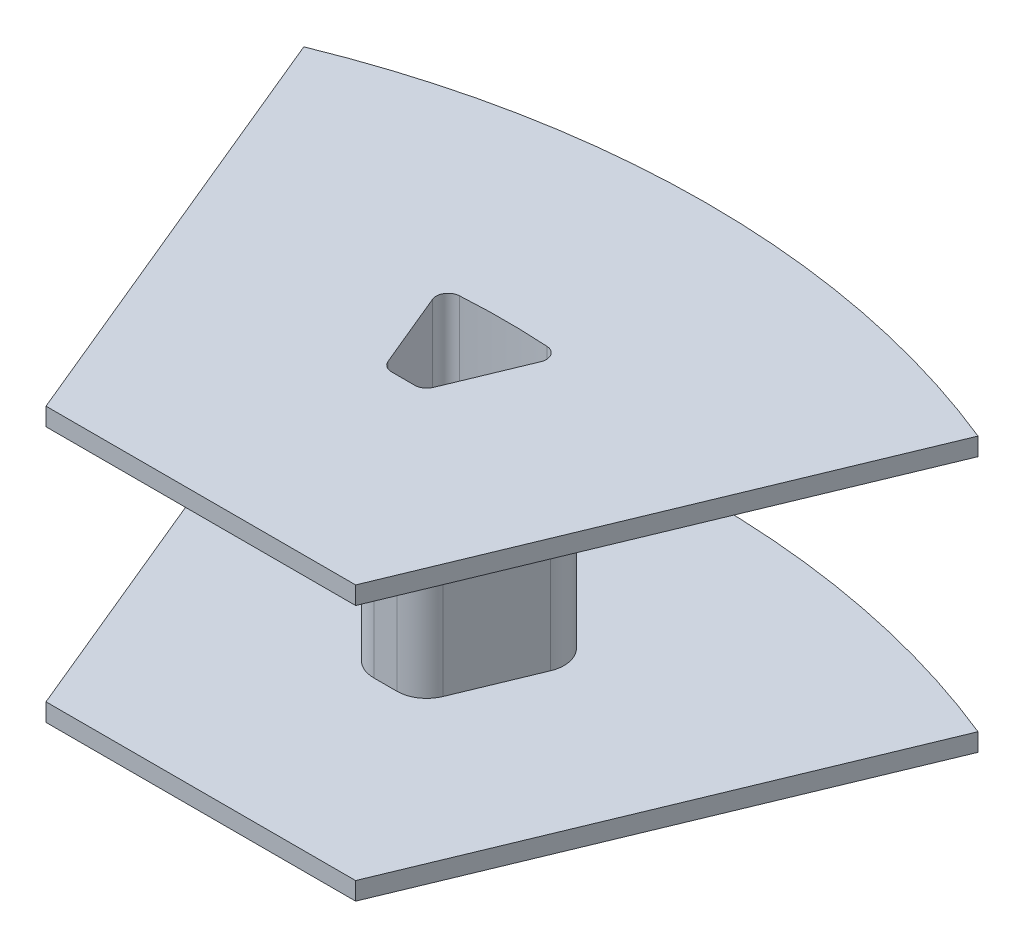
ISO-10303-21;
HEADER;
FILE_DESCRIPTION(('STEP AP214'),'2;1');
FILE_NAME('part.step','',(''),(''),'','','');
FILE_SCHEMA(('AUTOMOTIVE_DESIGN { 1 0 10303 214 1 1 1 1 }'));
ENDSEC;
DATA;
#1=APPLICATION_CONTEXT('core data for automotive mechanical design processes');
#2=APPLICATION_PROTOCOL_DEFINITION('international standard','automotive_design',2000,#1);
#3=PRODUCT_CONTEXT('',#1,'mechanical');
#4=PRODUCT('Part','Part','',(#3));
#5=PRODUCT_RELATED_PRODUCT_CATEGORY('part','',(#4));
#6=PRODUCT_DEFINITION_FORMATION('','',#4);
#7=PRODUCT_DEFINITION_CONTEXT('part definition',#1,'design');
#8=PRODUCT_DEFINITION('design','',#6,#7);
#9=PRODUCT_DEFINITION_SHAPE('','',#8);
#10=(LENGTH_UNIT() NAMED_UNIT(*) SI_UNIT(.MILLI.,.METRE.));
#11=(NAMED_UNIT(*) PLANE_ANGLE_UNIT() SI_UNIT($,.RADIAN.));
#12=(NAMED_UNIT(*) SI_UNIT($,.STERADIAN.) SOLID_ANGLE_UNIT());
#13=UNCERTAINTY_MEASURE_WITH_UNIT(LENGTH_MEASURE(1.E-05),#10,'distance_accuracy_value','');
#14=(GEOMETRIC_REPRESENTATION_CONTEXT(3) GLOBAL_UNCERTAINTY_ASSIGNED_CONTEXT((#13)) GLOBAL_UNIT_ASSIGNED_CONTEXT((#10,
#11,#12)) REPRESENTATION_CONTEXT('',''));
#15=CARTESIAN_POINT('',(0.,0.,0.));
#16=DIRECTION('',(0.,0.,1.));
#17=DIRECTION('',(1.,0.,0.));
#18=AXIS2_PLACEMENT_3D('',#15,#16,#17);
#19=CARTESIAN_POINT('',(0.,-0.75,0.));
#20=DIRECTION('',(0.,1.,0.));
#21=DIRECTION('',(0.,0.,1.));
#22=AXIS2_PLACEMENT_3D('',#19,#20,#21);
#23=PLANE('',#22);
#24=CARTESIAN_POINT('',(0.,-0.75,0.));
#25=DIRECTION('',(0.,1.,0.));
#26=DIRECTION('',(0.,0.,1.));
#27=AXIS2_PLACEMENT_3D('',#24,#25,#26);
#28=CIRCLE('',#27,75.);
#29=CARTESIAN_POINT('',(28.3078647305513,-0.75,-69.4526082620142));
#30=VERTEX_POINT('',#29);
#31=CARTESIAN_POINT('',(-28.3078647305513,-0.75,-69.4526082620142));
#32=VERTEX_POINT('',#31);
#33=EDGE_CURVE('E361',#30,#32,#28,.T.);
#34=ORIENTED_EDGE('',*,*,#33,.F.);
#35=DIRECTION('',(0.382683432365084,0.,-0.923879532511289));
#36=VECTOR('',#35,1.);
#37=CARTESIAN_POINT('',(28.3078647305513,-0.75,-69.4526082620142));
#38=LINE('',#37,#36);
#39=CARTESIAN_POINT('',(13.,-0.75,-32.4961536185439));
#40=VERTEX_POINT('',#39);
#41=EDGE_CURVE('E366',#40,#30,#38,.T.);
#42=ORIENTED_EDGE('',*,*,#41,.F.);
#43=DIRECTION('',(1.,0.,0.));
#44=VECTOR('',#43,1.);
#45=CARTESIAN_POINT('',(-13.,-0.75,-32.4961536185439));
#46=LINE('',#45,#44);
#47=CARTESIAN_POINT('',(-13.,-0.75,-32.4961536185439));
#48=VERTEX_POINT('',#47);
#49=EDGE_CURVE('E377',#48,#40,#46,.T.);
#50=ORIENTED_EDGE('',*,*,#49,.F.);
#51=DIRECTION('',(0.382683432365084,0.,0.923879532511289));
#52=VECTOR('',#51,1.);
#53=CARTESIAN_POINT('',(-28.3078647305513,-0.75,-69.4526082620142));
#54=LINE('',#53,#52);
#55=EDGE_CURVE('E375',#32,#48,#54,.T.);
#56=ORIENTED_EDGE('',*,*,#55,.F.);
#57=EDGE_LOOP('',(#34,#42,#50,#56));
#58=FACE_BOUND('',#57,.T.);
#59=CARTESIAN_POINT('',(0.972784517452535,-0.75,-50.4961536185439));
#60=DIRECTION('',(0.,-1.,0.));
#61=DIRECTION('',(0.,0.,-1.));
#62=AXIS2_PLACEMENT_3D('',#59,#60,#61);
#63=CIRCLE('',#62,2.5);
#64=CARTESIAN_POINT('',(3.28248334873076,-0.75,-49.5394450376311));
#65=VERTEX_POINT('',#64);
#66=CARTESIAN_POINT('',(0.972784517452535,-0.75,-47.9961536185439));
#67=VERTEX_POINT('',#66);
#68=EDGE_CURVE('E266',#65,#67,#63,.T.);
#69=ORIENTED_EDGE('',*,*,#68,.F.);
#70=DIRECTION('',(-0.382683432365084,0.,0.923879532511289));
#71=VECTOR('',#70,1.);
#72=CARTESIAN_POINT('',(3.28248334873076,-0.75,-49.5394450376311));
#73=LINE('',#72,#71);
#74=CARTESIAN_POINT('',(5.92882542639491,-0.75,-55.9282799722066));
#75=VERTEX_POINT('',#74);
#76=EDGE_CURVE('E271',#75,#65,#73,.T.);
#77=ORIENTED_EDGE('',*,*,#76,.F.);
#78=CARTESIAN_POINT('',(3.61912659511669,-0.75,-56.8849885531193));
#79=DIRECTION('',(0.,-1.,0.));
#80=DIRECTION('',(0.,0.,-1.));
#81=AXIS2_PLACEMENT_3D('',#78,#79,#80);
#82=CIRCLE('',#81,2.49999999999999);
#83=CARTESIAN_POINT('',(3.77786021770952,-0.750000000000001,-59.379944191414));
#84=VERTEX_POINT('',#83);
#85=EDGE_CURVE('E306',#84,#75,#82,.T.);
#86=ORIENTED_EDGE('',*,*,#85,.F.);
#87=CARTESIAN_POINT('',(0.,-0.75,0.));
#88=DIRECTION('',(0.,-1.,0.));
#89=DIRECTION('',(0.,0.,-1.));
#90=AXIS2_PLACEMENT_3D('',#87,#88,#89);
#91=CIRCLE('',#90,59.5);
#92=CARTESIAN_POINT('',(-3.77786021770949,-0.750000000000001,-59.379944191414));
#93=VERTEX_POINT('',#92);
#94=EDGE_CURVE('E303',#93,#84,#91,.T.);
#95=ORIENTED_EDGE('',*,*,#94,.F.);
#96=CARTESIAN_POINT('',(-3.61912659511669,-0.75,-56.8849885531193));
#97=DIRECTION('',(0.,-1.,0.));
#98=DIRECTION('',(0.,0.,-1.));
#99=AXIS2_PLACEMENT_3D('',#96,#97,#98);
#100=CIRCLE('',#99,2.5);
#101=CARTESIAN_POINT('',(-5.9288254263949,-0.750000000000001,-55.9282799722066));
#102=VERTEX_POINT('',#101);
#103=EDGE_CURVE('E300',#102,#93,#100,.T.);
#104=ORIENTED_EDGE('',*,*,#103,.F.);
#105=DIRECTION('',(-0.382683432365084,0.,-0.923879532511289));
#106=VECTOR('',#105,1.);
#107=CARTESIAN_POINT('',(-5.92882542639491,-0.75,-55.9282799722066));
#108=LINE('',#107,#106);
#109=CARTESIAN_POINT('',(-3.28248334873076,-0.75,-49.5394450376311));
#110=VERTEX_POINT('',#109);
#111=EDGE_CURVE('E297',#110,#102,#108,.T.);
#112=ORIENTED_EDGE('',*,*,#111,.F.);
#113=CARTESIAN_POINT('',(-0.972784517452536,-0.75,-50.4961536185439));
#114=DIRECTION('',(0.,-1.,0.));
#115=DIRECTION('',(0.,0.,-1.));
#116=AXIS2_PLACEMENT_3D('',#113,#114,#115);
#117=CIRCLE('',#116,2.5);
#118=CARTESIAN_POINT('',(-0.972784517452536,-0.750000000000001,-47.9961536185439));
#119=VERTEX_POINT('',#118);
#120=EDGE_CURVE('E53',#119,#110,#117,.T.);
#121=ORIENTED_EDGE('',*,*,#120,.F.);
#122=DIRECTION('',(-1.,0.,0.));
#123=VECTOR('',#122,1.);
#124=CARTESIAN_POINT('',(-0.972784517452536,-0.75,-47.9961536185439));
#125=LINE('',#124,#123);
#126=EDGE_CURVE('E48',#67,#119,#125,.T.);
#127=ORIENTED_EDGE('',*,*,#126,.F.);
#128=EDGE_LOOP('',(#69,#77,#86,#95,#104,#112,#121,#127));
#129=FACE_BOUND('',#128,.T.);
#130=ADVANCED_FACE('F33',(#58,#129),#23,.F.);
#131=CARTESIAN_POINT('',(0.,0.75,0.));
#132=DIRECTION('',(0.,1.,0.));
#133=DIRECTION('',(0.,0.,1.));
#134=AXIS2_PLACEMENT_3D('',#131,#132,#133);
#135=PLANE('',#134);
#136=CARTESIAN_POINT('',(0.,0.75,0.));
#137=DIRECTION('',(0.,1.,0.));
#138=DIRECTION('',(0.,0.,1.));
#139=AXIS2_PLACEMENT_3D('',#136,#137,#138);
#140=CIRCLE('',#139,75.);
#141=CARTESIAN_POINT('',(28.3078647305513,0.75,-69.4526082620142));
#142=VERTEX_POINT('',#141);
#143=CARTESIAN_POINT('',(-28.3078647305513,0.75,-69.4526082620142));
#144=VERTEX_POINT('',#143);
#145=EDGE_CURVE('E362',#142,#144,#140,.T.);
#146=ORIENTED_EDGE('',*,*,#145,.T.);
#147=DIRECTION('',(0.382683432365084,0.,0.923879532511289));
#148=VECTOR('',#147,1.);
#149=CARTESIAN_POINT('',(-28.3078647305513,0.75,-69.4526082620142));
#150=LINE('',#149,#148);
#151=CARTESIAN_POINT('',(-13.,0.75,-32.4961536185439));
#152=VERTEX_POINT('',#151);
#153=EDGE_CURVE('E365',#144,#152,#150,.T.);
#154=ORIENTED_EDGE('',*,*,#153,.T.);
#155=DIRECTION('',(1.,0.,0.));
#156=VECTOR('',#155,1.);
#157=CARTESIAN_POINT('',(-13.,0.75,-32.4961536185439));
#158=LINE('',#157,#156);
#159=CARTESIAN_POINT('',(13.,0.75,-32.4961536185439));
#160=VERTEX_POINT('',#159);
#161=EDGE_CURVE('E368',#152,#160,#158,.T.);
#162=ORIENTED_EDGE('',*,*,#161,.T.);
#163=DIRECTION('',(0.382683432365084,0.,-0.923879532511289));
#164=VECTOR('',#163,1.);
#165=CARTESIAN_POINT('',(28.3078647305513,0.75,-69.4526082620142));
#166=LINE('',#165,#164);
#167=EDGE_CURVE('E370',#160,#142,#166,.T.);
#168=ORIENTED_EDGE('',*,*,#167,.T.);
#169=EDGE_LOOP('',(#146,#154,#162,#168));
#170=FACE_BOUND('',#169,.T.);
#171=DIRECTION('',(0.382683432365085,0.,0.923879532511289));
#172=VECTOR('',#171,1.);
#173=CARTESIAN_POINT('',(-4.54300612762798,0.75,-56.5023051207543));
#174=LINE('',#173,#172);
#175=CARTESIAN_POINT('',(-4.54300612762798,0.75,-56.5023051207543));
#176=VERTEX_POINT('',#175);
#177=CARTESIAN_POINT('',(-1.89666404996382,0.75,-50.1134701861788));
#178=VERTEX_POINT('',#177);
#179=EDGE_CURVE('E335',#176,#178,#174,.T.);
#180=ORIENTED_EDGE('',*,*,#179,.F.);
#181=CARTESIAN_POINT('',(-3.61912659511669,0.75,-56.8849885531193));
#182=DIRECTION('',(0.,1.,0.));
#183=DIRECTION('',(0.,0.,-1.));
#184=AXIS2_PLACEMENT_3D('',#181,#182,#183);
#185=CIRCLE('',#184,0.999999999999988);
#186=CARTESIAN_POINT('',(-3.68262004415379,0.75,-57.8829708084372));
#187=VERTEX_POINT('',#186);
#188=EDGE_CURVE('E333',#187,#176,#185,.T.);
#189=ORIENTED_EDGE('',*,*,#188,.F.);
#190=CARTESIAN_POINT('',(0.,0.75,0.));
#191=DIRECTION('',(0.,1.,0.));
#192=DIRECTION('',(0.,0.,1.));
#193=AXIS2_PLACEMENT_3D('',#190,#191,#192);
#194=CIRCLE('',#193,58.);
#195=CARTESIAN_POINT('',(3.68262004415382,0.75,-57.8829708084372));
#196=VERTEX_POINT('',#195);
#197=EDGE_CURVE('E199',#196,#187,#194,.T.);
#198=ORIENTED_EDGE('',*,*,#197,.F.);
#199=CARTESIAN_POINT('',(3.61912659511669,0.75,-56.8849885531193));
#200=DIRECTION('',(0.,1.,0.));
#201=DIRECTION('',(0.,0.,-1.));
#202=AXIS2_PLACEMENT_3D('',#199,#200,#201);
#203=CIRCLE('',#202,0.999999999999988);
#204=CARTESIAN_POINT('',(4.54300612762798,0.75,-56.5023051207543));
#205=VERTEX_POINT('',#204);
#206=EDGE_CURVE('E345',#205,#196,#203,.T.);
#207=ORIENTED_EDGE('',*,*,#206,.F.);
#208=DIRECTION('',(0.382683432365084,0.,-0.923879532511289));
#209=VECTOR('',#208,1.);
#210=CARTESIAN_POINT('',(4.54300612762798,0.75,-56.5023051207543));
#211=LINE('',#210,#209);
#212=CARTESIAN_POINT('',(1.89666404996382,0.75,-50.1134701861788));
#213=VERTEX_POINT('',#212);
#214=EDGE_CURVE('E343',#213,#205,#211,.T.);
#215=ORIENTED_EDGE('',*,*,#214,.F.);
#216=CARTESIAN_POINT('',(0.972784517452535,0.75,-50.4961536185439));
#217=DIRECTION('',(0.,1.,0.));
#218=DIRECTION('',(0.,0.,-1.));
#219=AXIS2_PLACEMENT_3D('',#216,#217,#218);
#220=CIRCLE('',#219,1.);
#221=CARTESIAN_POINT('',(0.972784517452535,0.75,-49.4961536185439));
#222=VERTEX_POINT('',#221);
#223=EDGE_CURVE('E341',#222,#213,#220,.T.);
#224=ORIENTED_EDGE('',*,*,#223,.F.);
#225=DIRECTION('',(1.,0.,0.));
#226=VECTOR('',#225,1.);
#227=CARTESIAN_POINT('',(-0.972784517452536,0.75,-49.4961536185439));
#228=LINE('',#227,#226);
#229=CARTESIAN_POINT('',(-0.972784517452536,0.75,-49.4961536185439));
#230=VERTEX_POINT('',#229);
#231=EDGE_CURVE('E339',#230,#222,#228,.T.);
#232=ORIENTED_EDGE('',*,*,#231,.F.);
#233=CARTESIAN_POINT('',(-0.972784517452536,0.75,-50.4961536185439));
#234=DIRECTION('',(0.,1.,0.));
#235=DIRECTION('',(0.,0.,1.));
#236=AXIS2_PLACEMENT_3D('',#233,#234,#235);
#237=CIRCLE('',#236,0.999999999999999);
#238=EDGE_CURVE('E337',#178,#230,#237,.T.);
#239=ORIENTED_EDGE('',*,*,#238,.F.);
#240=EDGE_LOOP('',(#180,#189,#198,#207,#215,#224,#232,#239));
#241=FACE_BOUND('',#240,.T.);
#242=ADVANCED_FACE('F403',(#170,#241),#135,.T.);
#243=CARTESIAN_POINT('',(0.,0.75,0.));
#244=DIRECTION('',(0.,-1.,0.));
#245=DIRECTION('',(0.,0.,-1.));
#246=AXIS2_PLACEMENT_3D('',#243,#244,#245);
#247=CYLINDRICAL_SURFACE('',#246,75.);
#248=ORIENTED_EDGE('',*,*,#33,.T.);
#249=DIRECTION('',(0.,-1.,0.));
#250=VECTOR('',#249,1.);
#251=CARTESIAN_POINT('',(-28.3078647305513,0.75,-69.4526082620142));
#252=LINE('',#251,#250);
#253=EDGE_CURVE('E11',#144,#32,#252,.T.);
#254=ORIENTED_EDGE('',*,*,#253,.F.);
#255=ORIENTED_EDGE('',*,*,#145,.F.);
#256=DIRECTION('',(0.,-1.,0.));
#257=VECTOR('',#256,1.);
#258=CARTESIAN_POINT('',(28.3078647305513,0.75,-69.4526082620142));
#259=LINE('',#258,#257);
#260=EDGE_CURVE('E372',#142,#30,#259,.T.);
#261=ORIENTED_EDGE('',*,*,#260,.T.);
#262=EDGE_LOOP('',(#248,#254,#255,#261));
#263=FACE_BOUND('',#262,.T.);
#264=ADVANCED_FACE('F35',(#263),#247,.T.);
#265=CARTESIAN_POINT('',(-28.3078647305513,0.75,-69.4526082620142));
#266=DIRECTION('',(0.923879532511289,0.,-0.382683432365084));
#267=DIRECTION('',(-0.382683432365084,0.,-0.923879532511289));
#268=AXIS2_PLACEMENT_3D('',#265,#266,#267);
#269=PLANE('',#268);
#270=ORIENTED_EDGE('',*,*,#55,.T.);
#271=DIRECTION('',(0.,-1.,0.));
#272=VECTOR('',#271,1.);
#273=CARTESIAN_POINT('',(-13.,0.75,-32.4961536185439));
#274=LINE('',#273,#272);
#275=EDGE_CURVE('E41',#152,#48,#274,.T.);
#276=ORIENTED_EDGE('',*,*,#275,.F.);
#277=ORIENTED_EDGE('',*,*,#153,.F.);
#278=ORIENTED_EDGE('',*,*,#253,.T.);
#279=EDGE_LOOP('',(#270,#276,#277,#278));
#280=FACE_BOUND('',#279,.T.);
#281=ADVANCED_FACE('F405',(#280),#269,.F.);
#282=CARTESIAN_POINT('',(-13.,0.75,-32.4961536185439));
#283=DIRECTION('',(0.,0.,-1.));
#284=DIRECTION('',(-1.,0.,0.));
#285=AXIS2_PLACEMENT_3D('',#282,#283,#284);
#286=PLANE('',#285);
#287=ORIENTED_EDGE('',*,*,#49,.T.);
#288=DIRECTION('',(0.,-1.,0.));
#289=VECTOR('',#288,1.);
#290=CARTESIAN_POINT('',(13.,0.75,-32.4961536185439));
#291=LINE('',#290,#289);
#292=EDGE_CURVE('E382',#160,#40,#291,.T.);
#293=ORIENTED_EDGE('',*,*,#292,.F.);
#294=ORIENTED_EDGE('',*,*,#161,.F.);
#295=ORIENTED_EDGE('',*,*,#275,.T.);
#296=EDGE_LOOP('',(#287,#293,#294,#295));
#297=FACE_BOUND('',#296,.T.);
#298=ADVANCED_FACE('F389',(#297),#286,.F.);
#299=CARTESIAN_POINT('',(28.3078647305513,0.75,-69.4526082620142));
#300=DIRECTION('',(-0.923879532511289,0.,-0.382683432365084));
#301=DIRECTION('',(-0.382683432365084,0.,0.923879532511289));
#302=AXIS2_PLACEMENT_3D('',#299,#300,#301);
#303=PLANE('',#302);
#304=ORIENTED_EDGE('',*,*,#41,.T.);
#305=ORIENTED_EDGE('',*,*,#260,.F.);
#306=ORIENTED_EDGE('',*,*,#167,.F.);
#307=ORIENTED_EDGE('',*,*,#292,.T.);
#308=EDGE_LOOP('',(#304,#305,#306,#307));
#309=FACE_BOUND('',#308,.T.);
#310=ADVANCED_FACE('F397',(#309),#303,.F.);
#311=CARTESIAN_POINT('',(-3.61912659511669,0.75,-56.8849885531193));
#312=DIRECTION('',(0.,-1.,0.));
#313=DIRECTION('',(0.,0.,-1.));
#314=AXIS2_PLACEMENT_3D('',#311,#312,#313);
#315=CYLINDRICAL_SURFACE('',#314,0.999999999999988);
#316=DIRECTION('',(0.,-1.,0.));
#317=VECTOR('',#316,1.);
#318=CARTESIAN_POINT('',(-4.54300612762798,0.75,-56.5023051207543));
#319=LINE('',#318,#317);
#320=CARTESIAN_POINT('',(-4.54300612762798,-22.25,-56.5023051207543));
#321=VERTEX_POINT('',#320);
#322=EDGE_CURVE('E208',#176,#321,#319,.T.);
#323=ORIENTED_EDGE('',*,*,#322,.T.);
#324=CARTESIAN_POINT('',(-3.61912659511669,-22.25,-56.8849885531193));
#325=DIRECTION('',(0.,1.,0.));
#326=DIRECTION('',(0.,0.,-1.));
#327=AXIS2_PLACEMENT_3D('',#324,#325,#326);
#328=CIRCLE('',#327,0.999999999999988);
#329=CARTESIAN_POINT('',(-3.68262004415379,-22.25,-57.8829708084372));
#330=VERTEX_POINT('',#329);
#331=EDGE_CURVE('E205',#330,#321,#328,.T.);
#332=ORIENTED_EDGE('',*,*,#331,.F.);
#333=DIRECTION('',(0.,-1.,0.));
#334=VECTOR('',#333,1.);
#335=CARTESIAN_POINT('',(-3.68262004415379,0.75,-57.8829708084372));
#336=LINE('',#335,#334);
#337=EDGE_CURVE('E192',#187,#330,#336,.T.);
#338=ORIENTED_EDGE('',*,*,#337,.F.);
#339=ORIENTED_EDGE('',*,*,#188,.T.);
#340=EDGE_LOOP('',(#323,#332,#338,#339));
#341=FACE_BOUND('',#340,.T.);
#342=ADVANCED_FACE('F206',(#341),#315,.F.);
#343=CARTESIAN_POINT('',(-4.54300612762798,0.75,-56.5023051207543));
#344=DIRECTION('',(0.923879532511289,0.,-0.382683432365085));
#345=DIRECTION('',(-0.382683432365085,0.,-0.923879532511289));
#346=AXIS2_PLACEMENT_3D('',#343,#344,#345);
#347=PLANE('',#346);
#348=DIRECTION('',(0.,-1.,0.));
#349=VECTOR('',#348,1.);
#350=CARTESIAN_POINT('',(-1.89666404996382,0.75,-50.1134701861788));
#351=LINE('',#350,#349);
#352=CARTESIAN_POINT('',(-1.89666404996382,-22.25,-50.1134701861788));
#353=VERTEX_POINT('',#352);
#354=EDGE_CURVE('E358',#178,#353,#351,.T.);
#355=ORIENTED_EDGE('',*,*,#354,.T.);
#356=DIRECTION('',(0.382683432365085,0.,0.923879532511289));
#357=VECTOR('',#356,1.);
#358=CARTESIAN_POINT('',(-4.54300612762798,-22.25,-56.5023051207543));
#359=LINE('',#358,#357);
#360=EDGE_CURVE('E232',#321,#353,#359,.T.);
#361=ORIENTED_EDGE('',*,*,#360,.F.);
#362=ORIENTED_EDGE('',*,*,#322,.F.);
#363=ORIENTED_EDGE('',*,*,#179,.T.);
#364=EDGE_LOOP('',(#355,#361,#362,#363));
#365=FACE_BOUND('',#364,.T.);
#366=ADVANCED_FACE('F424',(#365),#347,.T.);
#367=CARTESIAN_POINT('',(-0.972784517452536,0.75,-50.4961536185439));
#368=DIRECTION('',(0.,-1.,0.));
#369=DIRECTION('',(0.,0.,-1.));
#370=AXIS2_PLACEMENT_3D('',#367,#368,#369);
#371=CYLINDRICAL_SURFACE('',#370,0.999999999999999);
#372=DIRECTION('',(0.,-1.,0.));
#373=VECTOR('',#372,1.);
#374=CARTESIAN_POINT('',(-0.972784517452536,0.75,-49.4961536185439));
#375=LINE('',#374,#373);
#376=CARTESIAN_POINT('',(-0.972784517452536,-22.25,-49.4961536185439));
#377=VERTEX_POINT('',#376);
#378=EDGE_CURVE('E356',#230,#377,#375,.T.);
#379=ORIENTED_EDGE('',*,*,#378,.T.);
#380=CARTESIAN_POINT('',(-0.972784517452536,-22.25,-50.4961536185439));
#381=DIRECTION('',(0.,1.,0.));
#382=DIRECTION('',(0.,0.,1.));
#383=AXIS2_PLACEMENT_3D('',#380,#381,#382);
#384=CIRCLE('',#383,0.999999999999999);
#385=EDGE_CURVE('E229',#353,#377,#384,.T.);
#386=ORIENTED_EDGE('',*,*,#385,.F.);
#387=ORIENTED_EDGE('',*,*,#354,.F.);
#388=ORIENTED_EDGE('',*,*,#238,.T.);
#389=EDGE_LOOP('',(#379,#386,#387,#388));
#390=FACE_BOUND('',#389,.T.);
#391=ADVANCED_FACE('F428',(#390),#371,.F.);
#392=CARTESIAN_POINT('',(-0.972784517452536,0.75,-49.4961536185439));
#393=DIRECTION('',(0.,0.,-1.));
#394=DIRECTION('',(-1.,0.,0.));
#395=AXIS2_PLACEMENT_3D('',#392,#393,#394);
#396=PLANE('',#395);
#397=DIRECTION('',(0.,-1.,0.));
#398=VECTOR('',#397,1.);
#399=CARTESIAN_POINT('',(0.972784517452535,0.75,-49.4961536185439));
#400=LINE('',#399,#398);
#401=CARTESIAN_POINT('',(0.972784517452535,-22.25,-49.4961536185439));
#402=VERTEX_POINT('',#401);
#403=EDGE_CURVE('E354',#222,#402,#400,.T.);
#404=ORIENTED_EDGE('',*,*,#403,.T.);
#405=DIRECTION('',(1.,0.,0.));
#406=VECTOR('',#405,1.);
#407=CARTESIAN_POINT('',(-0.972784517452536,-22.25,-49.4961536185439));
#408=LINE('',#407,#406);
#409=EDGE_CURVE('E226',#377,#402,#408,.T.);
#410=ORIENTED_EDGE('',*,*,#409,.F.);
#411=ORIENTED_EDGE('',*,*,#378,.F.);
#412=ORIENTED_EDGE('',*,*,#231,.T.);
#413=EDGE_LOOP('',(#404,#410,#411,#412));
#414=FACE_BOUND('',#413,.T.);
#415=ADVANCED_FACE('F434',(#414),#396,.T.);
#416=CARTESIAN_POINT('',(0.972784517452535,0.75,-50.4961536185439));
#417=DIRECTION('',(0.,-1.,0.));
#418=DIRECTION('',(0.,0.,-1.));
#419=AXIS2_PLACEMENT_3D('',#416,#417,#418);
#420=CYLINDRICAL_SURFACE('',#419,1.);
#421=DIRECTION('',(0.,-1.,0.));
#422=VECTOR('',#421,1.);
#423=CARTESIAN_POINT('',(1.89666404996382,0.75,-50.1134701861788));
#424=LINE('',#423,#422);
#425=CARTESIAN_POINT('',(1.89666404996382,-22.25,-50.1134701861788));
#426=VERTEX_POINT('',#425);
#427=EDGE_CURVE('E352',#213,#426,#424,.T.);
#428=ORIENTED_EDGE('',*,*,#427,.T.);
#429=CARTESIAN_POINT('',(0.972784517452535,-22.25,-50.4961536185439));
#430=DIRECTION('',(0.,1.,0.));
#431=DIRECTION('',(0.,0.,-1.));
#432=AXIS2_PLACEMENT_3D('',#429,#430,#431);
#433=CIRCLE('',#432,1.);
#434=EDGE_CURVE('E223',#402,#426,#433,.T.);
#435=ORIENTED_EDGE('',*,*,#434,.F.);
#436=ORIENTED_EDGE('',*,*,#403,.F.);
#437=ORIENTED_EDGE('',*,*,#223,.T.);
#438=EDGE_LOOP('',(#428,#435,#436,#437));
#439=FACE_BOUND('',#438,.T.);
#440=ADVANCED_FACE('F438',(#439),#420,.F.);
#441=CARTESIAN_POINT('',(4.54300612762798,0.75,-56.5023051207543));
#442=DIRECTION('',(-0.923879532511289,0.,-0.382683432365084));
#443=DIRECTION('',(-0.382683432365085,0.,0.923879532511289));
#444=AXIS2_PLACEMENT_3D('',#441,#442,#443);
#445=PLANE('',#444);
#446=DIRECTION('',(0.,-1.,0.));
#447=VECTOR('',#446,1.);
#448=CARTESIAN_POINT('',(4.54300612762798,0.75,-56.5023051207543));
#449=LINE('',#448,#447);
#450=CARTESIAN_POINT('',(4.54300612762798,-22.25,-56.5023051207543));
#451=VERTEX_POINT('',#450);
#452=EDGE_CURVE('E350',#205,#451,#449,.T.);
#453=ORIENTED_EDGE('',*,*,#452,.T.);
#454=DIRECTION('',(0.382683432365084,0.,-0.923879532511289));
#455=VECTOR('',#454,1.);
#456=CARTESIAN_POINT('',(4.54300612762798,-22.25,-56.5023051207543));
#457=LINE('',#456,#455);
#458=EDGE_CURVE('E219',#426,#451,#457,.T.);
#459=ORIENTED_EDGE('',*,*,#458,.F.);
#460=ORIENTED_EDGE('',*,*,#427,.F.);
#461=ORIENTED_EDGE('',*,*,#214,.T.);
#462=EDGE_LOOP('',(#453,#459,#460,#461));
#463=FACE_BOUND('',#462,.T.);
#464=ADVANCED_FACE('F442',(#463),#445,.T.);
#465=CARTESIAN_POINT('',(3.61912659511669,0.75,-56.8849885531193));
#466=DIRECTION('',(0.,-1.,0.));
#467=DIRECTION('',(0.,0.,-1.));
#468=AXIS2_PLACEMENT_3D('',#465,#466,#467);
#469=CYLINDRICAL_SURFACE('',#468,0.999999999999988);
#470=DIRECTION('',(0.,-1.,0.));
#471=VECTOR('',#470,1.);
#472=CARTESIAN_POINT('',(3.68262004415382,0.75,-57.8829708084372));
#473=LINE('',#472,#471);
#474=CARTESIAN_POINT('',(3.68262004415382,-22.25,-57.8829708084372));
#475=VERTEX_POINT('',#474);
#476=EDGE_CURVE('E202',#196,#475,#473,.T.);
#477=ORIENTED_EDGE('',*,*,#476,.T.);
#478=CARTESIAN_POINT('',(3.61912659511669,-22.25,-56.8849885531193));
#479=DIRECTION('',(0.,1.,0.));
#480=DIRECTION('',(0.,0.,-1.));
#481=AXIS2_PLACEMENT_3D('',#478,#479,#480);
#482=CIRCLE('',#481,0.999999999999988);
#483=EDGE_CURVE('E217',#451,#475,#482,.T.);
#484=ORIENTED_EDGE('',*,*,#483,.F.);
#485=ORIENTED_EDGE('',*,*,#452,.F.);
#486=ORIENTED_EDGE('',*,*,#206,.T.);
#487=EDGE_LOOP('',(#477,#484,#485,#486));
#488=FACE_BOUND('',#487,.T.);
#489=ADVANCED_FACE('F446',(#488),#469,.F.);
#490=CARTESIAN_POINT('',(0.,0.75,0.));
#491=DIRECTION('',(0.,-1.,0.));
#492=DIRECTION('',(0.,0.,-1.));
#493=AXIS2_PLACEMENT_3D('',#490,#491,#492);
#494=CYLINDRICAL_SURFACE('',#493,58.);
#495=ORIENTED_EDGE('',*,*,#337,.T.);
#496=CARTESIAN_POINT('',(0.,-22.25,0.));
#497=DIRECTION('',(0.,1.,0.));
#498=DIRECTION('',(0.,0.,1.));
#499=AXIS2_PLACEMENT_3D('',#496,#497,#498);
#500=CIRCLE('',#499,58.);
#501=EDGE_CURVE('E196',#475,#330,#500,.T.);
#502=ORIENTED_EDGE('',*,*,#501,.F.);
#503=ORIENTED_EDGE('',*,*,#476,.F.);
#504=ORIENTED_EDGE('',*,*,#197,.T.);
#505=EDGE_LOOP('',(#495,#502,#503,#504));
#506=FACE_BOUND('',#505,.T.);
#507=ADVANCED_FACE('F194',(#506),#494,.F.);
#508=CARTESIAN_POINT('',(0.972784517452535,-20.75,-50.4961536185439));
#509=DIRECTION('',(0.,1.,0.));
#510=DIRECTION('',(0.,0.,1.));
#511=AXIS2_PLACEMENT_3D('',#508,#509,#510);
#512=CYLINDRICAL_SURFACE('',#511,2.5);
#513=ORIENTED_EDGE('',*,*,#68,.T.);
#514=DIRECTION('',(0.,1.,0.));
#515=VECTOR('',#514,1.);
#516=CARTESIAN_POINT('',(0.972784517452535,-20.75,-47.9961536185439));
#517=LINE('',#516,#515);
#518=CARTESIAN_POINT('',(0.972784517452535,-20.75,-47.9961536185439));
#519=VERTEX_POINT('',#518);
#520=EDGE_CURVE('E331',#519,#67,#517,.T.);
#521=ORIENTED_EDGE('',*,*,#520,.F.);
#522=CARTESIAN_POINT('',(0.972784517452535,-20.75,-50.4961536185439));
#523=DIRECTION('',(0.,-1.,0.));
#524=DIRECTION('',(0.,0.,-1.));
#525=AXIS2_PLACEMENT_3D('',#522,#523,#524);
#526=CIRCLE('',#525,2.5);
#527=CARTESIAN_POINT('',(3.28248334873076,-20.75,-49.5394450376311));
#528=VERTEX_POINT('',#527);
#529=EDGE_CURVE('E267',#528,#519,#526,.T.);
#530=ORIENTED_EDGE('',*,*,#529,.F.);
#531=DIRECTION('',(0.,1.,0.));
#532=VECTOR('',#531,1.);
#533=CARTESIAN_POINT('',(3.28248334873076,-20.75,-49.5394450376311));
#534=LINE('',#533,#532);
#535=EDGE_CURVE('E292',#528,#65,#534,.T.);
#536=ORIENTED_EDGE('',*,*,#535,.T.);
#537=EDGE_LOOP('',(#513,#521,#530,#536));
#538=FACE_BOUND('',#537,.T.);
#539=ADVANCED_FACE('F453',(#538),#512,.T.);
#540=CARTESIAN_POINT('',(-0.972784517452536,-20.75,-47.9961536185439));
#541=DIRECTION('',(0.,0.,-1.));
#542=DIRECTION('',(-1.,0.,0.));
#543=AXIS2_PLACEMENT_3D('',#540,#541,#542);
#544=PLANE('',#543);
#545=ORIENTED_EDGE('',*,*,#126,.T.);
#546=DIRECTION('',(0.,1.,0.));
#547=VECTOR('',#546,1.);
#548=CARTESIAN_POINT('',(-0.972784517452536,-20.75,-47.9961536185439));
#549=LINE('',#548,#547);
#550=CARTESIAN_POINT('',(-0.972784517452536,-20.75,-47.9961536185439));
#551=VERTEX_POINT('',#550);
#552=EDGE_CURVE('E328',#551,#119,#549,.T.);
#553=ORIENTED_EDGE('',*,*,#552,.F.);
#554=DIRECTION('',(-1.,0.,0.));
#555=VECTOR('',#554,1.);
#556=CARTESIAN_POINT('',(-0.972784517452536,-20.75,-47.9961536185439));
#557=LINE('',#556,#555);
#558=EDGE_CURVE('E270',#519,#551,#557,.T.);
#559=ORIENTED_EDGE('',*,*,#558,.F.);
#560=ORIENTED_EDGE('',*,*,#520,.T.);
#561=EDGE_LOOP('',(#545,#553,#559,#560));
#562=FACE_BOUND('',#561,.T.);
#563=ADVANCED_FACE('F456',(#562),#544,.F.);
#564=CARTESIAN_POINT('',(-0.972784517452536,-20.75,-50.4961536185439));
#565=DIRECTION('',(0.,1.,0.));
#566=DIRECTION('',(0.,0.,1.));
#567=AXIS2_PLACEMENT_3D('',#564,#565,#566);
#568=CYLINDRICAL_SURFACE('',#567,2.5);
#569=ORIENTED_EDGE('',*,*,#120,.T.);
#570=DIRECTION('',(0.,1.,0.));
#571=VECTOR('',#570,1.);
#572=CARTESIAN_POINT('',(-3.28248334873076,-20.75,-49.5394450376311));
#573=LINE('',#572,#571);
#574=CARTESIAN_POINT('',(-3.28248334873076,-20.75,-49.5394450376311));
#575=VERTEX_POINT('',#574);
#576=EDGE_CURVE('E325',#575,#110,#573,.T.);
#577=ORIENTED_EDGE('',*,*,#576,.F.);
#578=CARTESIAN_POINT('',(-0.972784517452536,-20.75,-50.4961536185439));
#579=DIRECTION('',(0.,-1.,0.));
#580=DIRECTION('',(0.,0.,-1.));
#581=AXIS2_PLACEMENT_3D('',#578,#579,#580);
#582=CIRCLE('',#581,2.5);
#583=EDGE_CURVE('E274',#551,#575,#582,.T.);
#584=ORIENTED_EDGE('',*,*,#583,.F.);
#585=ORIENTED_EDGE('',*,*,#552,.T.);
#586=EDGE_LOOP('',(#569,#577,#584,#585));
#587=FACE_BOUND('',#586,.T.);
#588=ADVANCED_FACE('F460',(#587),#568,.T.);
#589=CARTESIAN_POINT('',(-5.92882542639491,-20.75,-55.9282799722066));
#590=DIRECTION('',(0.923879532511289,0.,-0.382683432365084));
#591=DIRECTION('',(-0.382683432365084,0.,-0.923879532511289));
#592=AXIS2_PLACEMENT_3D('',#589,#590,#591);
#593=PLANE('',#592);
#594=ORIENTED_EDGE('',*,*,#111,.T.);
#595=DIRECTION('',(0.,1.,0.));
#596=VECTOR('',#595,1.);
#597=CARTESIAN_POINT('',(-5.9288254263949,-20.75,-55.9282799722066));
#598=LINE('',#597,#596);
#599=CARTESIAN_POINT('',(-5.9288254263949,-20.75,-55.9282799722066));
#600=VERTEX_POINT('',#599);
#601=EDGE_CURVE('E322',#600,#102,#598,.T.);
#602=ORIENTED_EDGE('',*,*,#601,.F.);
#603=DIRECTION('',(-0.382683432365084,0.,-0.923879532511289));
#604=VECTOR('',#603,1.);
#605=CARTESIAN_POINT('',(-5.92882542639491,-20.75,-55.9282799722066));
#606=LINE('',#605,#604);
#607=EDGE_CURVE('E277',#575,#600,#606,.T.);
#608=ORIENTED_EDGE('',*,*,#607,.F.);
#609=ORIENTED_EDGE('',*,*,#576,.T.);
#610=EDGE_LOOP('',(#594,#602,#608,#609));
#611=FACE_BOUND('',#610,.T.);
#612=ADVANCED_FACE('F464',(#611),#593,.F.);
#613=CARTESIAN_POINT('',(-3.61912659511669,-20.75,-56.8849885531193));
#614=DIRECTION('',(0.,1.,0.));
#615=DIRECTION('',(0.,0.,1.));
#616=AXIS2_PLACEMENT_3D('',#613,#614,#615);
#617=CYLINDRICAL_SURFACE('',#616,2.5);
#618=ORIENTED_EDGE('',*,*,#103,.T.);
#619=DIRECTION('',(0.,1.,0.));
#620=VECTOR('',#619,1.);
#621=CARTESIAN_POINT('',(-3.77786021770949,-20.75,-59.379944191414));
#622=LINE('',#621,#620);
#623=CARTESIAN_POINT('',(-3.77786021770949,-20.75,-59.379944191414));
#624=VERTEX_POINT('',#623);
#625=EDGE_CURVE('E319',#624,#93,#622,.T.);
#626=ORIENTED_EDGE('',*,*,#625,.F.);
#627=CARTESIAN_POINT('',(-3.61912659511669,-20.75,-56.8849885531193));
#628=DIRECTION('',(0.,-1.,0.));
#629=DIRECTION('',(0.,0.,-1.));
#630=AXIS2_PLACEMENT_3D('',#627,#628,#629);
#631=CIRCLE('',#630,2.5);
#632=EDGE_CURVE('E280',#600,#624,#631,.T.);
#633=ORIENTED_EDGE('',*,*,#632,.F.);
#634=ORIENTED_EDGE('',*,*,#601,.T.);
#635=EDGE_LOOP('',(#618,#626,#633,#634));
#636=FACE_BOUND('',#635,.T.);
#637=ADVANCED_FACE('F468',(#636),#617,.T.);
#638=CARTESIAN_POINT('',(0.,-20.75,0.));
#639=DIRECTION('',(0.,1.,0.));
#640=DIRECTION('',(0.,0.,1.));
#641=AXIS2_PLACEMENT_3D('',#638,#639,#640);
#642=CYLINDRICAL_SURFACE('',#641,59.5);
#643=ORIENTED_EDGE('',*,*,#94,.T.);
#644=DIRECTION('',(0.,1.,0.));
#645=VECTOR('',#644,1.);
#646=CARTESIAN_POINT('',(3.77786021770952,-20.75,-59.379944191414));
#647=LINE('',#646,#645);
#648=CARTESIAN_POINT('',(3.77786021770952,-20.75,-59.379944191414));
#649=VERTEX_POINT('',#648);
#650=EDGE_CURVE('E316',#649,#84,#647,.T.);
#651=ORIENTED_EDGE('',*,*,#650,.F.);
#652=CARTESIAN_POINT('',(0.,-20.75,0.));
#653=DIRECTION('',(0.,-1.,0.));
#654=DIRECTION('',(0.,0.,-1.));
#655=AXIS2_PLACEMENT_3D('',#652,#653,#654);
#656=CIRCLE('',#655,59.5);
#657=EDGE_CURVE('E283',#624,#649,#656,.T.);
#658=ORIENTED_EDGE('',*,*,#657,.F.);
#659=ORIENTED_EDGE('',*,*,#625,.T.);
#660=EDGE_LOOP('',(#643,#651,#658,#659));
#661=FACE_BOUND('',#660,.T.);
#662=ADVANCED_FACE('F472',(#661),#642,.T.);
#663=CARTESIAN_POINT('',(3.61912659511669,-20.75,-56.8849885531193));
#664=DIRECTION('',(0.,1.,0.));
#665=DIRECTION('',(0.,0.,1.));
#666=AXIS2_PLACEMENT_3D('',#663,#664,#665);
#667=CYLINDRICAL_SURFACE('',#666,2.49999999999999);
#668=ORIENTED_EDGE('',*,*,#85,.T.);
#669=DIRECTION('',(0.,1.,0.));
#670=VECTOR('',#669,1.);
#671=CARTESIAN_POINT('',(5.92882542639491,-20.75,-55.9282799722066));
#672=LINE('',#671,#670);
#673=CARTESIAN_POINT('',(5.92882542639491,-20.75,-55.9282799722066));
#674=VERTEX_POINT('',#673);
#675=EDGE_CURVE('E313',#674,#75,#672,.T.);
#676=ORIENTED_EDGE('',*,*,#675,.F.);
#677=CARTESIAN_POINT('',(3.61912659511669,-20.75,-56.8849885531193));
#678=DIRECTION('',(0.,-1.,0.));
#679=DIRECTION('',(0.,0.,-1.));
#680=AXIS2_PLACEMENT_3D('',#677,#678,#679);
#681=CIRCLE('',#680,2.49999999999999);
#682=EDGE_CURVE('E286',#649,#674,#681,.T.);
#683=ORIENTED_EDGE('',*,*,#682,.F.);
#684=ORIENTED_EDGE('',*,*,#650,.T.);
#685=EDGE_LOOP('',(#668,#676,#683,#684));
#686=FACE_BOUND('',#685,.T.);
#687=ADVANCED_FACE('F476',(#686),#667,.T.);
#688=CARTESIAN_POINT('',(3.28248334873076,-20.75,-49.5394450376311));
#689=DIRECTION('',(-0.923879532511289,0.,-0.382683432365084));
#690=DIRECTION('',(-0.382683432365084,0.,0.923879532511289));
#691=AXIS2_PLACEMENT_3D('',#688,#689,#690);
#692=PLANE('',#691);
#693=ORIENTED_EDGE('',*,*,#76,.T.);
#694=ORIENTED_EDGE('',*,*,#535,.F.);
#695=DIRECTION('',(-0.382683432365084,0.,0.923879532511289));
#696=VECTOR('',#695,1.);
#697=CARTESIAN_POINT('',(3.28248334873076,-20.75,-49.5394450376311));
#698=LINE('',#697,#696);
#699=EDGE_CURVE('E289',#674,#528,#698,.T.);
#700=ORIENTED_EDGE('',*,*,#699,.F.);
#701=ORIENTED_EDGE('',*,*,#675,.T.);
#702=EDGE_LOOP('',(#693,#694,#700,#701));
#703=FACE_BOUND('',#702,.T.);
#704=ADVANCED_FACE('F480',(#703),#692,.F.);
#705=CARTESIAN_POINT('',(0.,-20.75,0.));
#706=DIRECTION('',(0.,-1.,0.));
#707=DIRECTION('',(0.,0.,1.));
#708=AXIS2_PLACEMENT_3D('',#705,#706,#707);
#709=PLANE('',#708);
#710=CARTESIAN_POINT('',(0.,-20.75,0.));
#711=DIRECTION('',(0.,1.,0.));
#712=DIRECTION('',(0.,0.,1.));
#713=AXIS2_PLACEMENT_3D('',#710,#711,#712);
#714=CIRCLE('',#713,75.);
#715=CARTESIAN_POINT('',(28.3078647305513,-20.75,-69.4526082620142));
#716=VERTEX_POINT('',#715);
#717=CARTESIAN_POINT('',(-28.3078647305513,-20.75,-69.4526082620142));
#718=VERTEX_POINT('',#717);
#719=EDGE_CURVE('E234',#716,#718,#714,.T.);
#720=ORIENTED_EDGE('',*,*,#719,.T.);
#721=DIRECTION('',(0.382683432365084,0.,0.923879532511289));
#722=VECTOR('',#721,1.);
#723=CARTESIAN_POINT('',(-28.3078647305513,-20.75,-69.4526082620142));
#724=LINE('',#723,#722);
#725=CARTESIAN_POINT('',(-13.,-20.75,-32.4961536185439));
#726=VERTEX_POINT('',#725);
#727=EDGE_CURVE('E239',#718,#726,#724,.T.);
#728=ORIENTED_EDGE('',*,*,#727,.T.);
#729=DIRECTION('',(1.,0.,0.));
#730=VECTOR('',#729,1.);
#731=CARTESIAN_POINT('',(-13.,-20.75,-32.4961536185439));
#732=LINE('',#731,#730);
#733=CARTESIAN_POINT('',(13.,-20.75,-32.4961536185439));
#734=VERTEX_POINT('',#733);
#735=EDGE_CURVE('E254',#726,#734,#732,.T.);
#736=ORIENTED_EDGE('',*,*,#735,.T.);
#737=DIRECTION('',(0.382683432365084,0.,-0.923879532511289));
#738=VECTOR('',#737,1.);
#739=CARTESIAN_POINT('',(28.3078647305513,-20.75,-69.4526082620142));
#740=LINE('',#739,#738);
#741=EDGE_CURVE('E251',#734,#716,#740,.T.);
#742=ORIENTED_EDGE('',*,*,#741,.T.);
#743=EDGE_LOOP('',(#720,#728,#736,#742));
#744=FACE_BOUND('',#743,.T.);
#745=ORIENTED_EDGE('',*,*,#699,.T.);
#746=ORIENTED_EDGE('',*,*,#529,.T.);
#747=ORIENTED_EDGE('',*,*,#558,.T.);
#748=ORIENTED_EDGE('',*,*,#583,.T.);
#749=ORIENTED_EDGE('',*,*,#607,.T.);
#750=ORIENTED_EDGE('',*,*,#632,.T.);
#751=ORIENTED_EDGE('',*,*,#657,.T.);
#752=ORIENTED_EDGE('',*,*,#682,.T.);
#753=EDGE_LOOP('',(#745,#746,#747,#748,#749,#750,#751,#752));
#754=FACE_BOUND('',#753,.T.);
#755=ADVANCED_FACE('F484',(#744,#754),#709,.F.);
#756=CARTESIAN_POINT('',(0.,-22.25,0.));
#757=DIRECTION('',(0.,1.,0.));
#758=DIRECTION('',(0.,0.,1.));
#759=AXIS2_PLACEMENT_3D('',#756,#757,#758);
#760=CYLINDRICAL_SURFACE('',#759,75.);
#761=ORIENTED_EDGE('',*,*,#719,.F.);
#762=DIRECTION('',(0.,1.,0.));
#763=VECTOR('',#762,1.);
#764=CARTESIAN_POINT('',(28.3078647305513,-22.25,-69.4526082620142));
#765=LINE('',#764,#763);
#766=CARTESIAN_POINT('',(28.3078647305513,-22.25,-69.4526082620142));
#767=VERTEX_POINT('',#766);
#768=EDGE_CURVE('E264',#767,#716,#765,.T.);
#769=ORIENTED_EDGE('',*,*,#768,.F.);
#770=CARTESIAN_POINT('',(0.,-22.25,0.));
#771=DIRECTION('',(0.,1.,0.));
#772=DIRECTION('',(0.,0.,1.));
#773=AXIS2_PLACEMENT_3D('',#770,#771,#772);
#774=CIRCLE('',#773,75.);
#775=CARTESIAN_POINT('',(-28.3078647305513,-22.25,-69.4526082620142));
#776=VERTEX_POINT('',#775);
#777=EDGE_CURVE('E235',#767,#776,#774,.T.);
#778=ORIENTED_EDGE('',*,*,#777,.T.);
#779=DIRECTION('',(0.,1.,0.));
#780=VECTOR('',#779,1.);
#781=CARTESIAN_POINT('',(-28.3078647305513,-22.25,-69.4526082620142));
#782=LINE('',#781,#780);
#783=EDGE_CURVE('E248',#776,#718,#782,.T.);
#784=ORIENTED_EDGE('',*,*,#783,.T.);
#785=EDGE_LOOP('',(#761,#769,#778,#784));
#786=FACE_BOUND('',#785,.T.);
#787=ADVANCED_FACE('F486',(#786),#760,.T.);
#788=CARTESIAN_POINT('',(28.3078647305513,-22.25,-69.4526082620142));
#789=DIRECTION('',(0.923879532511289,0.,0.382683432365084));
#790=DIRECTION('',(0.382683432365084,0.,-0.923879532511289));
#791=AXIS2_PLACEMENT_3D('',#788,#789,#790);
#792=PLANE('',#791);
#793=ORIENTED_EDGE('',*,*,#741,.F.);
#794=DIRECTION('',(0.,1.,0.));
#795=VECTOR('',#794,1.);
#796=CARTESIAN_POINT('',(13.,-22.25,-32.4961536185439));
#797=LINE('',#796,#795);
#798=CARTESIAN_POINT('',(13.,-22.25,-32.4961536185439));
#799=VERTEX_POINT('',#798);
#800=EDGE_CURVE('E262',#799,#734,#797,.T.);
#801=ORIENTED_EDGE('',*,*,#800,.F.);
#802=DIRECTION('',(0.382683432365084,0.,-0.923879532511289));
#803=VECTOR('',#802,1.);
#804=CARTESIAN_POINT('',(28.3078647305513,-22.25,-69.4526082620142));
#805=LINE('',#804,#803);
#806=EDGE_CURVE('E238',#799,#767,#805,.T.);
#807=ORIENTED_EDGE('',*,*,#806,.T.);
#808=ORIENTED_EDGE('',*,*,#768,.T.);
#809=EDGE_LOOP('',(#793,#801,#807,#808));
#810=FACE_BOUND('',#809,.T.);
#811=ADVANCED_FACE('F489',(#810),#792,.T.);
#812=CARTESIAN_POINT('',(-13.,-22.25,-32.4961536185439));
#813=DIRECTION('',(0.,0.,1.));
#814=DIRECTION('',(1.,0.,0.));
#815=AXIS2_PLACEMENT_3D('',#812,#813,#814);
#816=PLANE('',#815);
#817=ORIENTED_EDGE('',*,*,#735,.F.);
#818=DIRECTION('',(0.,1.,0.));
#819=VECTOR('',#818,1.);
#820=CARTESIAN_POINT('',(-13.,-22.25,-32.4961536185439));
#821=LINE('',#820,#819);
#822=CARTESIAN_POINT('',(-13.,-22.25,-32.4961536185439));
#823=VERTEX_POINT('',#822);
#824=EDGE_CURVE('E260',#823,#726,#821,.T.);
#825=ORIENTED_EDGE('',*,*,#824,.F.);
#826=DIRECTION('',(1.,0.,0.));
#827=VECTOR('',#826,1.);
#828=CARTESIAN_POINT('',(-13.,-22.25,-32.4961536185439));
#829=LINE('',#828,#827);
#830=EDGE_CURVE('E242',#823,#799,#829,.T.);
#831=ORIENTED_EDGE('',*,*,#830,.T.);
#832=ORIENTED_EDGE('',*,*,#800,.T.);
#833=EDGE_LOOP('',(#817,#825,#831,#832));
#834=FACE_BOUND('',#833,.T.);
#835=ADVANCED_FACE('F493',(#834),#816,.T.);
#836=CARTESIAN_POINT('',(-28.3078647305513,-22.25,-69.4526082620142));
#837=DIRECTION('',(-0.923879532511289,0.,0.382683432365084));
#838=DIRECTION('',(0.382683432365084,0.,0.923879532511289));
#839=AXIS2_PLACEMENT_3D('',#836,#837,#838);
#840=PLANE('',#839);
#841=ORIENTED_EDGE('',*,*,#727,.F.);
#842=ORIENTED_EDGE('',*,*,#783,.F.);
#843=DIRECTION('',(0.382683432365084,0.,0.923879532511289));
#844=VECTOR('',#843,1.);
#845=CARTESIAN_POINT('',(-28.3078647305513,-22.25,-69.4526082620142));
#846=LINE('',#845,#844);
#847=EDGE_CURVE('E245',#776,#823,#846,.T.);
#848=ORIENTED_EDGE('',*,*,#847,.T.);
#849=ORIENTED_EDGE('',*,*,#824,.T.);
#850=EDGE_LOOP('',(#841,#842,#848,#849));
#851=FACE_BOUND('',#850,.T.);
#852=ADVANCED_FACE('F497',(#851),#840,.T.);
#853=CARTESIAN_POINT('',(0.,-22.25,0.));
#854=DIRECTION('',(0.,-1.,0.));
#855=DIRECTION('',(0.,0.,1.));
#856=AXIS2_PLACEMENT_3D('',#853,#854,#855);
#857=PLANE('',#856);
#858=ORIENTED_EDGE('',*,*,#331,.T.);
#859=ORIENTED_EDGE('',*,*,#360,.T.);
#860=ORIENTED_EDGE('',*,*,#385,.T.);
#861=ORIENTED_EDGE('',*,*,#409,.T.);
#862=ORIENTED_EDGE('',*,*,#434,.T.);
#863=ORIENTED_EDGE('',*,*,#458,.T.);
#864=ORIENTED_EDGE('',*,*,#483,.T.);
#865=ORIENTED_EDGE('',*,*,#501,.T.);
#866=EDGE_LOOP('',(#858,#859,#860,#861,#862,#863,#864,#865));
#867=FACE_BOUND('',#866,.T.);
#868=ORIENTED_EDGE('',*,*,#777,.F.);
#869=ORIENTED_EDGE('',*,*,#806,.F.);
#870=ORIENTED_EDGE('',*,*,#830,.F.);
#871=ORIENTED_EDGE('',*,*,#847,.F.);
#872=EDGE_LOOP('',(#868,#869,#870,#871));
#873=FACE_BOUND('',#872,.T.);
#874=ADVANCED_FACE('F213',(#867,#873),#857,.T.);
#875=CLOSED_SHELL('',(#130,#242,#264,#281,#298,#310,#342,#366,#391,#415,#440,#464,#489,#507,
#539,#563,#588,#612,#637,#662,#687,#704,#755,#787,#811,#835,#852,#874));
#876=MANIFOLD_SOLID_BREP('B2',#875);
#877=ADVANCED_BREP_SHAPE_REPRESENTATION('',(#18,#876),#14);
#878=SHAPE_DEFINITION_REPRESENTATION(#9,#877);
ENDSEC;
END-ISO-10303-21;
